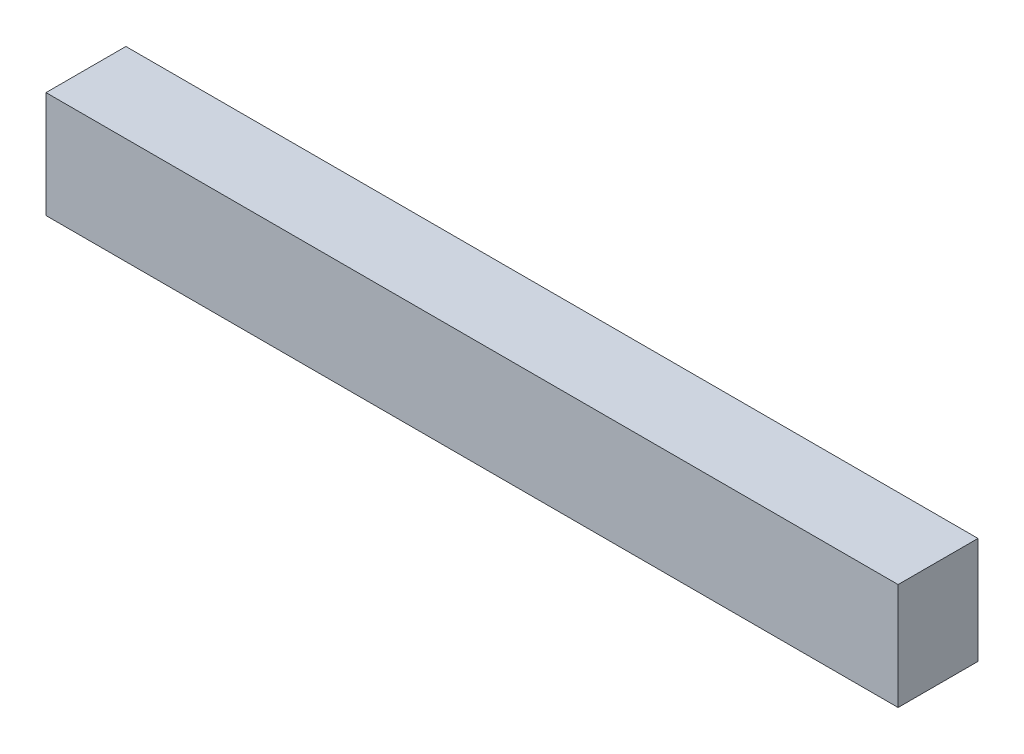
ISO-10303-21;
HEADER;
FILE_DESCRIPTION(('STEP AP214'),'2;1');
FILE_NAME('part.step','',(''),(''),'','','');
FILE_SCHEMA(('AUTOMOTIVE_DESIGN { 1 0 10303 214 1 1 1 1 }'));
ENDSEC;
DATA;
#1=APPLICATION_CONTEXT('core data for automotive mechanical design processes');
#2=APPLICATION_PROTOCOL_DEFINITION('international standard','automotive_design',2000,#1);
#3=PRODUCT_CONTEXT('',#1,'mechanical');
#4=PRODUCT('Part','Part','',(#3));
#5=PRODUCT_RELATED_PRODUCT_CATEGORY('part','',(#4));
#6=PRODUCT_DEFINITION_FORMATION('','',#4);
#7=PRODUCT_DEFINITION_CONTEXT('part definition',#1,'design');
#8=PRODUCT_DEFINITION('design','',#6,#7);
#9=PRODUCT_DEFINITION_SHAPE('','',#8);
#10=(LENGTH_UNIT() NAMED_UNIT(*) SI_UNIT(.MILLI.,.METRE.));
#11=(NAMED_UNIT(*) PLANE_ANGLE_UNIT() SI_UNIT($,.RADIAN.));
#12=(NAMED_UNIT(*) SI_UNIT($,.STERADIAN.) SOLID_ANGLE_UNIT());
#13=UNCERTAINTY_MEASURE_WITH_UNIT(LENGTH_MEASURE(1.E-05),#10,'distance_accuracy_value','');
#14=(GEOMETRIC_REPRESENTATION_CONTEXT(3) GLOBAL_UNCERTAINTY_ASSIGNED_CONTEXT((#13)) GLOBAL_UNIT_ASSIGNED_CONTEXT((#10,
#11,#12)) REPRESENTATION_CONTEXT('',''));
#15=CARTESIAN_POINT('',(0.,0.,0.));
#16=DIRECTION('',(0.,0.,1.));
#17=DIRECTION('',(1.,0.,0.));
#18=AXIS2_PLACEMENT_3D('',#15,#16,#17);
#19=CARTESIAN_POINT('',(0.,4.,0.));
#20=DIRECTION('',(1.,0.,0.));
#21=DIRECTION('',(0.,0.,-1.));
#22=AXIS2_PLACEMENT_3D('',#19,#20,#21);
#23=PLANE('',#22);
#24=DIRECTION('',(0.,0.,1.));
#25=VECTOR('',#24,1.);
#26=CARTESIAN_POINT('',(0.,0.,0.));
#27=LINE('',#26,#25);
#28=CARTESIAN_POINT('',(0.,0.,-3.));
#29=VERTEX_POINT('',#28);
#30=CARTESIAN_POINT('',(0.,0.,0.));
#31=VERTEX_POINT('',#30);
#32=EDGE_CURVE('E109',#29,#31,#27,.T.);
#33=ORIENTED_EDGE('',*,*,#32,.T.);
#34=DIRECTION('',(0.,-1.,0.));
#35=VECTOR('',#34,1.);
#36=CARTESIAN_POINT('',(0.,4.,0.));
#37=LINE('',#36,#35);
#38=CARTESIAN_POINT('',(0.,4.,0.));
#39=VERTEX_POINT('',#38);
#40=EDGE_CURVE('E11',#39,#31,#37,.T.);
#41=ORIENTED_EDGE('',*,*,#40,.F.);
#42=DIRECTION('',(0.,0.,1.));
#43=VECTOR('',#42,1.);
#44=CARTESIAN_POINT('',(0.,4.,0.));
#45=LINE('',#44,#43);
#46=CARTESIAN_POINT('',(0.,4.,-3.));
#47=VERTEX_POINT('',#46);
#48=EDGE_CURVE('E93',#47,#39,#45,.T.);
#49=ORIENTED_EDGE('',*,*,#48,.F.);
#50=DIRECTION('',(0.,-1.,0.));
#51=VECTOR('',#50,1.);
#52=CARTESIAN_POINT('',(0.,4.,-3.));
#53=LINE('',#52,#51);
#54=EDGE_CURVE('E105',#47,#29,#53,.T.);
#55=ORIENTED_EDGE('',*,*,#54,.T.);
#56=EDGE_LOOP('',(#33,#41,#49,#55));
#57=FACE_BOUND('',#56,.T.);
#58=ADVANCED_FACE('F41',(#57),#23,.F.);
#59=CARTESIAN_POINT('',(0.,4.,0.));
#60=DIRECTION('',(0.,0.,-1.));
#61=DIRECTION('',(-1.,0.,0.));
#62=AXIS2_PLACEMENT_3D('',#59,#60,#61);
#63=PLANE('',#62);
#64=DIRECTION('',(1.,0.,0.));
#65=VECTOR('',#64,1.);
#66=CARTESIAN_POINT('',(0.,0.,0.));
#67=LINE('',#66,#65);
#68=CARTESIAN_POINT('',(32.,0.,0.));
#69=VERTEX_POINT('',#68);
#70=EDGE_CURVE('E98',#31,#69,#67,.T.);
#71=ORIENTED_EDGE('',*,*,#70,.T.);
#72=DIRECTION('',(0.,-1.,0.));
#73=VECTOR('',#72,1.);
#74=CARTESIAN_POINT('',(32.,4.,0.));
#75=LINE('',#74,#73);
#76=CARTESIAN_POINT('',(32.,4.,0.));
#77=VERTEX_POINT('',#76);
#78=EDGE_CURVE('E50',#77,#69,#75,.T.);
#79=ORIENTED_EDGE('',*,*,#78,.F.);
#80=DIRECTION('',(1.,0.,0.));
#81=VECTOR('',#80,1.);
#82=CARTESIAN_POINT('',(0.,4.,0.));
#83=LINE('',#82,#81);
#84=EDGE_CURVE('E88',#39,#77,#83,.T.);
#85=ORIENTED_EDGE('',*,*,#84,.F.);
#86=ORIENTED_EDGE('',*,*,#40,.T.);
#87=EDGE_LOOP('',(#71,#79,#85,#86));
#88=FACE_BOUND('',#87,.T.);
#89=ADVANCED_FACE('F97',(#88),#63,.F.);
#90=CARTESIAN_POINT('',(32.,4.,0.));
#91=DIRECTION('',(-1.,0.,0.));
#92=DIRECTION('',(0.,0.,1.));
#93=AXIS2_PLACEMENT_3D('',#90,#91,#92);
#94=PLANE('',#93);
#95=DIRECTION('',(0.,0.,-1.));
#96=VECTOR('',#95,1.);
#97=CARTESIAN_POINT('',(32.,0.,0.));
#98=LINE('',#97,#96);
#99=CARTESIAN_POINT('',(32.,0.,-3.));
#100=VERTEX_POINT('',#99);
#101=EDGE_CURVE('E75',#69,#100,#98,.T.);
#102=ORIENTED_EDGE('',*,*,#101,.T.);
#103=DIRECTION('',(0.,-1.,0.));
#104=VECTOR('',#103,1.);
#105=CARTESIAN_POINT('',(32.,4.,-3.));
#106=LINE('',#105,#104);
#107=CARTESIAN_POINT('',(32.,4.,-3.));
#108=VERTEX_POINT('',#107);
#109=EDGE_CURVE('E100',#108,#100,#106,.T.);
#110=ORIENTED_EDGE('',*,*,#109,.F.);
#111=DIRECTION('',(0.,0.,-1.));
#112=VECTOR('',#111,1.);
#113=CARTESIAN_POINT('',(32.,4.,0.));
#114=LINE('',#113,#112);
#115=EDGE_CURVE('E91',#77,#108,#114,.T.);
#116=ORIENTED_EDGE('',*,*,#115,.F.);
#117=ORIENTED_EDGE('',*,*,#78,.T.);
#118=EDGE_LOOP('',(#102,#110,#116,#117));
#119=FACE_BOUND('',#118,.T.);
#120=ADVANCED_FACE('F101',(#119),#94,.F.);
#121=CARTESIAN_POINT('',(0.,4.,-3.));
#122=DIRECTION('',(0.,0.,1.));
#123=DIRECTION('',(1.,0.,0.));
#124=AXIS2_PLACEMENT_3D('',#121,#122,#123);
#125=PLANE('',#124);
#126=DIRECTION('',(-1.,0.,0.));
#127=VECTOR('',#126,1.);
#128=CARTESIAN_POINT('',(0.,0.,-3.));
#129=LINE('',#128,#127);
#130=EDGE_CURVE('E81',#100,#29,#129,.T.);
#131=ORIENTED_EDGE('',*,*,#130,.T.);
#132=ORIENTED_EDGE('',*,*,#54,.F.);
#133=DIRECTION('',(-1.,0.,0.));
#134=VECTOR('',#133,1.);
#135=CARTESIAN_POINT('',(0.,4.,-3.));
#136=LINE('',#135,#134);
#137=EDGE_CURVE('E58',#108,#47,#136,.T.);
#138=ORIENTED_EDGE('',*,*,#137,.F.);
#139=ORIENTED_EDGE('',*,*,#109,.T.);
#140=EDGE_LOOP('',(#131,#132,#138,#139));
#141=FACE_BOUND('',#140,.T.);
#142=ADVANCED_FACE('F122',(#141),#125,.F.);
#143=CARTESIAN_POINT('',(0.,4.,0.));
#144=DIRECTION('',(0.,-1.,0.));
#145=DIRECTION('',(0.,0.,-1.));
#146=AXIS2_PLACEMENT_3D('',#143,#144,#145);
#147=PLANE('',#146);
#148=ORIENTED_EDGE('',*,*,#48,.T.);
#149=ORIENTED_EDGE('',*,*,#84,.T.);
#150=ORIENTED_EDGE('',*,*,#115,.T.);
#151=ORIENTED_EDGE('',*,*,#137,.T.);
#152=EDGE_LOOP('',(#148,#149,#150,#151));
#153=FACE_BOUND('',#152,.T.);
#154=ADVANCED_FACE('F89',(#153),#147,.F.);
#155=CARTESIAN_POINT('',(0.,0.,0.));
#156=DIRECTION('',(0.,-1.,0.));
#157=DIRECTION('',(0.,0.,-1.));
#158=AXIS2_PLACEMENT_3D('',#155,#156,#157);
#159=PLANE('',#158);
#160=ORIENTED_EDGE('',*,*,#32,.F.);
#161=ORIENTED_EDGE('',*,*,#130,.F.);
#162=ORIENTED_EDGE('',*,*,#101,.F.);
#163=ORIENTED_EDGE('',*,*,#70,.F.);
#164=EDGE_LOOP('',(#160,#161,#162,#163));
#165=FACE_BOUND('',#164,.T.);
#166=ADVANCED_FACE('F125',(#165),#159,.T.);
#167=CLOSED_SHELL('',(#58,#89,#120,#142,#154,#166));
#168=MANIFOLD_SOLID_BREP('B2',#167);
#169=ADVANCED_BREP_SHAPE_REPRESENTATION('',(#18,#168),#14);
#170=SHAPE_DEFINITION_REPRESENTATION(#9,#169);
ENDSEC;
END-ISO-10303-21;
